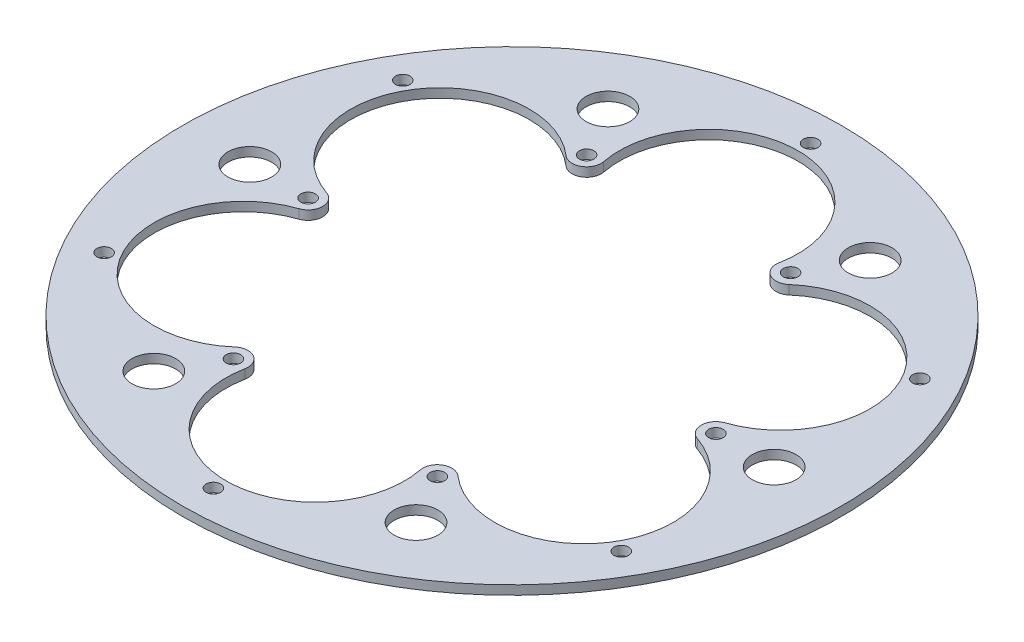
ISO-10303-21;
HEADER;
FILE_DESCRIPTION(('STEP AP214'),'2;1');
FILE_NAME('part.step','',(''),(''),'','','');
FILE_SCHEMA(('AUTOMOTIVE_DESIGN { 1 0 10303 214 1 1 1 1 }'));
ENDSEC;
DATA;
#1=APPLICATION_CONTEXT('core data for automotive mechanical design processes');
#2=APPLICATION_PROTOCOL_DEFINITION('international standard','automotive_design',2000,#1);
#3=PRODUCT_CONTEXT('',#1,'mechanical');
#4=PRODUCT('Part','Part','',(#3));
#5=PRODUCT_RELATED_PRODUCT_CATEGORY('part','',(#4));
#6=PRODUCT_DEFINITION_FORMATION('','',#4);
#7=PRODUCT_DEFINITION_CONTEXT('part definition',#1,'design');
#8=PRODUCT_DEFINITION('design','',#6,#7);
#9=PRODUCT_DEFINITION_SHAPE('','',#8);
#10=(LENGTH_UNIT() NAMED_UNIT(*) SI_UNIT(.MILLI.,.METRE.));
#11=(NAMED_UNIT(*) PLANE_ANGLE_UNIT() SI_UNIT($,.RADIAN.));
#12=(NAMED_UNIT(*) SI_UNIT($,.STERADIAN.) SOLID_ANGLE_UNIT());
#13=UNCERTAINTY_MEASURE_WITH_UNIT(LENGTH_MEASURE(1.E-05),#10,'distance_accuracy_value','');
#14=(GEOMETRIC_REPRESENTATION_CONTEXT(3) GLOBAL_UNCERTAINTY_ASSIGNED_CONTEXT((#13)) GLOBAL_UNIT_ASSIGNED_CONTEXT((#10,
#11,#12)) REPRESENTATION_CONTEXT('',''));
#15=CARTESIAN_POINT('',(0.,0.,0.));
#16=DIRECTION('',(0.,0.,1.));
#17=DIRECTION('',(1.,0.,0.));
#18=AXIS2_PLACEMENT_3D('',#15,#16,#17);
#19=CARTESIAN_POINT('',(0.,2.5,0.));
#20=DIRECTION('',(0.,1.,0.));
#21=DIRECTION('',(0.,0.,1.));
#22=AXIS2_PLACEMENT_3D('',#19,#20,#21);
#23=PLANE('',#22);
#24=CARTESIAN_POINT('',(-72.,2.5,0.));
#25=DIRECTION('',(0.,1.,0.));
#26=DIRECTION('',(0.,0.,1.));
#27=AXIS2_PLACEMENT_3D('',#24,#25,#26);
#28=CIRCLE('',#27,6.);
#29=CARTESIAN_POINT('',(-72.,2.5,6.00000000000006));
#30=VERTEX_POINT('',#29);
#31=EDGE_CURVE('E256',#30,#30,#28,.T.);
#32=ORIENTED_EDGE('',*,*,#31,.F.);
#33=EDGE_LOOP('',(#32));
#34=FACE_BOUND('',#33,.T.);
#35=CARTESIAN_POINT('',(-36.,2.5,62.3538290724796));
#36=DIRECTION('',(0.,1.,0.));
#37=DIRECTION('',(0.,0.,1.));
#38=AXIS2_PLACEMENT_3D('',#35,#36,#37);
#39=CIRCLE('',#38,6.);
#40=CARTESIAN_POINT('',(-36.,2.5,68.3538290724796));
#41=VERTEX_POINT('',#40);
#42=EDGE_CURVE('E260',#41,#41,#39,.T.);
#43=ORIENTED_EDGE('',*,*,#42,.F.);
#44=EDGE_LOOP('',(#43));
#45=FACE_BOUND('',#44,.T.);
#46=CARTESIAN_POINT('',(36.,2.5,-62.3538290724796));
#47=DIRECTION('',(0.,1.,0.));
#48=DIRECTION('',(0.,0.,1.));
#49=AXIS2_PLACEMENT_3D('',#46,#47,#48);
#50=CIRCLE('',#49,6.00000000000001);
#51=CARTESIAN_POINT('',(36.,2.5,-56.3538290724796));
#52=VERTEX_POINT('',#51);
#53=EDGE_CURVE('E264',#52,#52,#50,.T.);
#54=ORIENTED_EDGE('',*,*,#53,.F.);
#55=EDGE_LOOP('',(#54));
#56=FACE_BOUND('',#55,.T.);
#57=CARTESIAN_POINT('',(72.,2.5,0.));
#58=DIRECTION('',(0.,1.,0.));
#59=DIRECTION('',(0.,0.,1.));
#60=AXIS2_PLACEMENT_3D('',#57,#58,#59);
#61=CIRCLE('',#60,6.);
#62=CARTESIAN_POINT('',(72.,2.5,5.99999999999999));
#63=VERTEX_POINT('',#62);
#64=EDGE_CURVE('E268',#63,#63,#61,.T.);
#65=ORIENTED_EDGE('',*,*,#64,.F.);
#66=EDGE_LOOP('',(#65));
#67=FACE_BOUND('',#66,.T.);
#68=CARTESIAN_POINT('',(36.,2.5,62.3538290724796));
#69=DIRECTION('',(0.,1.,0.));
#70=DIRECTION('',(0.,0.,1.));
#71=AXIS2_PLACEMENT_3D('',#68,#69,#70);
#72=CIRCLE('',#71,6.);
#73=CARTESIAN_POINT('',(36.,2.5,68.3538290724796));
#74=VERTEX_POINT('',#73);
#75=EDGE_CURVE('E272',#74,#74,#72,.T.);
#76=ORIENTED_EDGE('',*,*,#75,.F.);
#77=EDGE_LOOP('',(#76));
#78=FACE_BOUND('',#77,.T.);
#79=CARTESIAN_POINT('',(-36.,2.5,-62.3538290724796));
#80=DIRECTION('',(0.,1.,0.));
#81=DIRECTION('',(0.,0.,1.));
#82=AXIS2_PLACEMENT_3D('',#79,#80,#81);
#83=CIRCLE('',#82,6.);
#84=CARTESIAN_POINT('',(-36.,2.5,-56.3538290724796));
#85=VERTEX_POINT('',#84);
#86=EDGE_CURVE('E276',#85,#85,#83,.T.);
#87=ORIENTED_EDGE('',*,*,#86,.F.);
#88=EDGE_LOOP('',(#87));
#89=FACE_BOUND('',#88,.T.);
#90=CARTESIAN_POINT('',(-56.,2.5,0.));
#91=DIRECTION('',(0.,1.,0.));
#92=DIRECTION('',(0.,0.,1.));
#93=AXIS2_PLACEMENT_3D('',#90,#91,#92);
#94=CIRCLE('',#93,2.00000000000001);
#95=CARTESIAN_POINT('',(-56.,2.5,2.00000000000002));
#96=VERTEX_POINT('',#95);
#97=EDGE_CURVE('E280',#96,#96,#94,.T.);
#98=ORIENTED_EDGE('',*,*,#97,.F.);
#99=EDGE_LOOP('',(#98));
#100=FACE_BOUND('',#99,.T.);
#101=CARTESIAN_POINT('',(-28.,2.5,48.4974226119286));
#102=DIRECTION('',(0.,1.,0.));
#103=DIRECTION('',(0.,0.,1.));
#104=AXIS2_PLACEMENT_3D('',#101,#102,#103);
#105=CIRCLE('',#104,2.00000000000001);
#106=CARTESIAN_POINT('',(-28.,2.5,50.4974226119286));
#107=VERTEX_POINT('',#106);
#108=EDGE_CURVE('E284',#107,#107,#105,.T.);
#109=ORIENTED_EDGE('',*,*,#108,.F.);
#110=EDGE_LOOP('',(#109));
#111=FACE_BOUND('',#110,.T.);
#112=CARTESIAN_POINT('',(28.,2.5,48.4974226119286));
#113=DIRECTION('',(0.,1.,0.));
#114=DIRECTION('',(0.,0.,1.));
#115=AXIS2_PLACEMENT_3D('',#112,#113,#114);
#116=CIRCLE('',#115,2.00000000000001);
#117=CARTESIAN_POINT('',(28.,2.5,50.4974226119286));
#118=VERTEX_POINT('',#117);
#119=EDGE_CURVE('E288',#118,#118,#116,.T.);
#120=ORIENTED_EDGE('',*,*,#119,.F.);
#121=EDGE_LOOP('',(#120));
#122=FACE_BOUND('',#121,.T.);
#123=CARTESIAN_POINT('',(56.,2.5,0.));
#124=DIRECTION('',(0.,1.,0.));
#125=DIRECTION('',(0.,0.,1.));
#126=AXIS2_PLACEMENT_3D('',#123,#124,#125);
#127=CIRCLE('',#126,2.00000000000001);
#128=CARTESIAN_POINT('',(56.,2.5,2.));
#129=VERTEX_POINT('',#128);
#130=EDGE_CURVE('E292',#129,#129,#127,.T.);
#131=ORIENTED_EDGE('',*,*,#130,.F.);
#132=EDGE_LOOP('',(#131));
#133=FACE_BOUND('',#132,.T.);
#134=CARTESIAN_POINT('',(28.,2.5,-48.4974226119285));
#135=DIRECTION('',(0.,1.,0.));
#136=DIRECTION('',(0.,0.,1.));
#137=AXIS2_PLACEMENT_3D('',#134,#135,#136);
#138=CIRCLE('',#137,2.00000000000001);
#139=CARTESIAN_POINT('',(28.,2.5,-46.4974226119285));
#140=VERTEX_POINT('',#139);
#141=EDGE_CURVE('E295',#140,#140,#138,.T.);
#142=ORIENTED_EDGE('',*,*,#141,.F.);
#143=EDGE_LOOP('',(#142));
#144=FACE_BOUND('',#143,.T.);
#145=CARTESIAN_POINT('',(-46.7653718043597,2.5,-27.));
#146=DIRECTION('',(0.,1.,0.));
#147=DIRECTION('',(0.,0.,1.));
#148=AXIS2_PLACEMENT_3D('',#145,#146,#147);
#149=CIRCLE('',#148,24.5355630382812);
#150=CARTESIAN_POINT('',(-30.6304540448962,2.5,-45.4840007168583));
#151=VERTEX_POINT('',#150);
#152=CARTESIAN_POINT('',(-54.705527108997,2.5,-3.7847509739028));
#153=VERTEX_POINT('',#152);
#154=EDGE_CURVE('E138',#151,#153,#149,.T.);
#155=ORIENTED_EDGE('',*,*,#154,.F.);
#156=CARTESIAN_POINT('',(-28.,2.5,-48.4974226119286));
#157=DIRECTION('',(0.,-1.,0.));
#158=DIRECTION('',(0.,0.,1.));
#159=AXIS2_PLACEMENT_3D('',#156,#157,#158);
#160=CIRCLE('',#159,3.99999999999998);
#161=CARTESIAN_POINT('',(-24.0750730641008,2.5,-49.2687516907611));
#162=VERTEX_POINT('',#161);
#163=EDGE_CURVE('E130',#162,#151,#160,.T.);
#164=ORIENTED_EDGE('',*,*,#163,.F.);
#165=CARTESIAN_POINT('',(0.,2.5,-54.));
#166=DIRECTION('',(0.,1.,0.));
#167=DIRECTION('',(0.,0.,1.));
#168=AXIS2_PLACEMENT_3D('',#165,#166,#167);
#169=CIRCLE('',#168,24.5355630382811);
#170=CARTESIAN_POINT('',(24.0750730641008,2.5,-49.2687516907611));
#171=VERTEX_POINT('',#170);
#172=EDGE_CURVE('E173',#171,#162,#169,.T.);
#173=ORIENTED_EDGE('',*,*,#172,.F.);
#174=CARTESIAN_POINT('',(28.,2.5,-48.4974226119285));
#175=DIRECTION('',(0.,-1.,0.));
#176=DIRECTION('',(0.,0.,1.));
#177=AXIS2_PLACEMENT_3D('',#174,#175,#176);
#178=CIRCLE('',#177,3.99999999999998);
#179=CARTESIAN_POINT('',(30.6304540448962,2.5,-45.4840007168583));
#180=VERTEX_POINT('',#179);
#181=EDGE_CURVE('E171',#180,#171,#178,.T.);
#182=ORIENTED_EDGE('',*,*,#181,.F.);
#183=CARTESIAN_POINT('',(46.7653718043597,2.5,-27.));
#184=DIRECTION('',(0.,1.,0.));
#185=DIRECTION('',(0.,0.,1.));
#186=AXIS2_PLACEMENT_3D('',#183,#184,#185);
#187=CIRCLE('',#186,24.5355630382811);
#188=CARTESIAN_POINT('',(54.705527108997,2.5,-3.78475097390282));
#189=VERTEX_POINT('',#188);
#190=EDGE_CURVE('E169',#189,#180,#187,.T.);
#191=ORIENTED_EDGE('',*,*,#190,.F.);
#192=CARTESIAN_POINT('',(56.,2.5,0.));
#193=DIRECTION('',(0.,-1.,0.));
#194=DIRECTION('',(0.,0.,1.));
#195=AXIS2_PLACEMENT_3D('',#192,#193,#194);
#196=CIRCLE('',#195,3.99999999999998);
#197=CARTESIAN_POINT('',(54.705527108997,2.5,3.7847509739028));
#198=VERTEX_POINT('',#197);
#199=EDGE_CURVE('E167',#198,#189,#196,.T.);
#200=ORIENTED_EDGE('',*,*,#199,.F.);
#201=CARTESIAN_POINT('',(46.7653718043597,2.5,27.));
#202=DIRECTION('',(0.,1.,0.));
#203=DIRECTION('',(0.,0.,1.));
#204=AXIS2_PLACEMENT_3D('',#201,#202,#203);
#205=CIRCLE('',#204,24.5355630382811);
#206=CARTESIAN_POINT('',(30.6304540448962,2.5,45.4840007168583));
#207=VERTEX_POINT('',#206);
#208=EDGE_CURVE('E165',#207,#198,#205,.T.);
#209=ORIENTED_EDGE('',*,*,#208,.F.);
#210=CARTESIAN_POINT('',(28.,2.5,48.4974226119286));
#211=DIRECTION('',(0.,-1.,0.));
#212=DIRECTION('',(0.,0.,1.));
#213=AXIS2_PLACEMENT_3D('',#210,#211,#212);
#214=CIRCLE('',#213,3.99999999999998);
#215=CARTESIAN_POINT('',(24.0750730641008,2.5,49.2687516907611));
#216=VERTEX_POINT('',#215);
#217=EDGE_CURVE('E163',#216,#207,#214,.T.);
#218=ORIENTED_EDGE('',*,*,#217,.F.);
#219=CARTESIAN_POINT('',(0.,2.5,54.));
#220=DIRECTION('',(0.,1.,0.));
#221=DIRECTION('',(0.,0.,1.));
#222=AXIS2_PLACEMENT_3D('',#219,#220,#221);
#223=CIRCLE('',#222,24.5355630382811);
#224=CARTESIAN_POINT('',(-24.0750730641008,2.5,49.2687516907611));
#225=VERTEX_POINT('',#224);
#226=EDGE_CURVE('E161',#225,#216,#223,.T.);
#227=ORIENTED_EDGE('',*,*,#226,.F.);
#228=CARTESIAN_POINT('',(-28.,2.5,48.4974226119286));
#229=DIRECTION('',(0.,-1.,0.));
#230=DIRECTION('',(0.,0.,1.));
#231=AXIS2_PLACEMENT_3D('',#228,#229,#230);
#232=CIRCLE('',#231,3.99999999999999);
#233=CARTESIAN_POINT('',(-30.6304540448962,2.5,45.4840007168583));
#234=VERTEX_POINT('',#233);
#235=EDGE_CURVE('E159',#234,#225,#232,.T.);
#236=ORIENTED_EDGE('',*,*,#235,.F.);
#237=CARTESIAN_POINT('',(-46.7653718043597,2.5,27.));
#238=DIRECTION('',(0.,1.,0.));
#239=DIRECTION('',(0.,0.,1.));
#240=AXIS2_PLACEMENT_3D('',#237,#238,#239);
#241=CIRCLE('',#240,24.5355630382811);
#242=CARTESIAN_POINT('',(-54.705527108997,2.5,3.78475097390285));
#243=VERTEX_POINT('',#242);
#244=EDGE_CURVE('E154',#243,#234,#241,.T.);
#245=ORIENTED_EDGE('',*,*,#244,.F.);
#246=CARTESIAN_POINT('',(-56.,2.5,0.));
#247=DIRECTION('',(0.,-1.,0.));
#248=DIRECTION('',(0.,0.,1.));
#249=AXIS2_PLACEMENT_3D('',#246,#247,#248);
#250=CIRCLE('',#249,3.99999999999997);
#251=EDGE_CURVE('E152',#153,#243,#250,.T.);
#252=ORIENTED_EDGE('',*,*,#251,.F.);
#253=EDGE_LOOP('',(#155,#164,#173,#182,#191,#200,#209,#218,#227,#236,#245,#252));
#254=FACE_BOUND('',#253,.T.);
#255=CARTESIAN_POINT('',(-28.,2.5,-48.4974226119286));
#256=DIRECTION('',(0.,1.,0.));
#257=DIRECTION('',(0.,0.,1.));
#258=AXIS2_PLACEMENT_3D('',#255,#256,#257);
#259=CIRCLE('',#258,2.00000000000001);
#260=CARTESIAN_POINT('',(-28.,2.5,-46.4974226119285));
#261=VERTEX_POINT('',#260);
#262=EDGE_CURVE('E226',#261,#261,#259,.T.);
#263=ORIENTED_EDGE('',*,*,#262,.F.);
#264=EDGE_LOOP('',(#263));
#265=FACE_BOUND('',#264,.T.);
#266=CARTESIAN_POINT('',(0.,2.5,0.));
#267=DIRECTION('',(0.,1.,0.));
#268=DIRECTION('',(0.,0.,1.));
#269=AXIS2_PLACEMENT_3D('',#266,#267,#268);
#270=CIRCLE('',#269,90.5);
#271=CARTESIAN_POINT('',(0.,2.5,90.5));
#272=VERTEX_POINT('',#271);
#273=EDGE_CURVE('E11',#272,#272,#270,.T.);
#274=ORIENTED_EDGE('',*,*,#273,.T.);
#275=EDGE_LOOP('',(#274));
#276=FACE_BOUND('',#275,.T.);
#277=CARTESIAN_POINT('',(0.,2.5,-82.));
#278=DIRECTION('',(0.,1.,0.));
#279=DIRECTION('',(0.,0.,1.));
#280=AXIS2_PLACEMENT_3D('',#277,#278,#279);
#281=CIRCLE('',#280,2.00000000000001);
#282=CARTESIAN_POINT('',(0.,2.5,-80.));
#283=VERTEX_POINT('',#282);
#284=EDGE_CURVE('E176',#283,#283,#281,.T.);
#285=ORIENTED_EDGE('',*,*,#284,.F.);
#286=EDGE_LOOP('',(#285));
#287=FACE_BOUND('',#286,.T.);
#288=CARTESIAN_POINT('',(71.014083110324,2.5,-41.));
#289=DIRECTION('',(0.,1.,0.));
#290=DIRECTION('',(0.,0.,1.));
#291=AXIS2_PLACEMENT_3D('',#288,#289,#290);
#292=CIRCLE('',#291,2.);
#293=CARTESIAN_POINT('',(71.014083110324,2.5,-39.));
#294=VERTEX_POINT('',#293);
#295=EDGE_CURVE('E302',#294,#294,#292,.T.);
#296=ORIENTED_EDGE('',*,*,#295,.F.);
#297=EDGE_LOOP('',(#296));
#298=FACE_BOUND('',#297,.T.);
#299=CARTESIAN_POINT('',(71.014083110324,2.5,41.));
#300=DIRECTION('',(0.,1.,0.));
#301=DIRECTION('',(0.,0.,1.));
#302=AXIS2_PLACEMENT_3D('',#299,#300,#301);
#303=CIRCLE('',#302,2.);
#304=CARTESIAN_POINT('',(71.014083110324,2.5,43.));
#305=VERTEX_POINT('',#304);
#306=EDGE_CURVE('E321',#305,#305,#303,.T.);
#307=ORIENTED_EDGE('',*,*,#306,.F.);
#308=EDGE_LOOP('',(#307));
#309=FACE_BOUND('',#308,.T.);
#310=CARTESIAN_POINT('',(0.,2.5,82.));
#311=DIRECTION('',(0.,1.,0.));
#312=DIRECTION('',(0.,0.,1.));
#313=AXIS2_PLACEMENT_3D('',#310,#311,#312);
#314=CIRCLE('',#313,2.00000000000001);
#315=CARTESIAN_POINT('',(0.,2.5,84.));
#316=VERTEX_POINT('',#315);
#317=EDGE_CURVE('E325',#316,#316,#314,.T.);
#318=ORIENTED_EDGE('',*,*,#317,.F.);
#319=EDGE_LOOP('',(#318));
#320=FACE_BOUND('',#319,.T.);
#321=CARTESIAN_POINT('',(-71.014083110324,2.5,41.));
#322=DIRECTION('',(0.,1.,0.));
#323=DIRECTION('',(0.,0.,1.));
#324=AXIS2_PLACEMENT_3D('',#321,#322,#323);
#325=CIRCLE('',#324,2.);
#326=CARTESIAN_POINT('',(-71.014083110324,2.5,43.));
#327=VERTEX_POINT('',#326);
#328=EDGE_CURVE('E329',#327,#327,#325,.T.);
#329=ORIENTED_EDGE('',*,*,#328,.F.);
#330=EDGE_LOOP('',(#329));
#331=FACE_BOUND('',#330,.T.);
#332=CARTESIAN_POINT('',(-71.014083110324,2.5,-40.9999999999999));
#333=DIRECTION('',(0.,1.,0.));
#334=DIRECTION('',(0.,0.,1.));
#335=AXIS2_PLACEMENT_3D('',#332,#333,#334);
#336=CIRCLE('',#335,2.);
#337=CARTESIAN_POINT('',(-71.014083110324,2.5,-38.9999999999999));
#338=VERTEX_POINT('',#337);
#339=EDGE_CURVE('E332',#338,#338,#336,.T.);
#340=ORIENTED_EDGE('',*,*,#339,.F.);
#341=EDGE_LOOP('',(#340));
#342=FACE_BOUND('',#341,.T.);
#343=ADVANCED_FACE('F41',(#34,#45,#56,#67,#78,#89,#100,#111,#122,#133,#144,#254,#265,#276,#287,
#298,#309,#320,#331,#342),#23,.T.);
#344=CARTESIAN_POINT('',(0.,0.,0.));
#345=DIRECTION('',(0.,1.,0.));
#346=DIRECTION('',(0.,0.,1.));
#347=AXIS2_PLACEMENT_3D('',#344,#345,#346);
#348=PLANE('',#347);
#349=CARTESIAN_POINT('',(-72.,0.,0.));
#350=DIRECTION('',(0.,1.,0.));
#351=DIRECTION('',(0.,0.,1.));
#352=AXIS2_PLACEMENT_3D('',#349,#350,#351);
#353=CIRCLE('',#352,6.);
#354=CARTESIAN_POINT('',(-72.,0.,6.00000000000006));
#355=VERTEX_POINT('',#354);
#356=EDGE_CURVE('E595',#355,#355,#353,.T.);
#357=ORIENTED_EDGE('',*,*,#356,.T.);
#358=EDGE_LOOP('',(#357));
#359=FACE_BOUND('',#358,.T.);
#360=CARTESIAN_POINT('',(-36.,0.,62.3538290724796));
#361=DIRECTION('',(0.,1.,0.));
#362=DIRECTION('',(0.,0.,1.));
#363=AXIS2_PLACEMENT_3D('',#360,#361,#362);
#364=CIRCLE('',#363,6.);
#365=CARTESIAN_POINT('',(-36.,0.,68.3538290724796));
#366=VERTEX_POINT('',#365);
#367=EDGE_CURVE('E602',#366,#366,#364,.T.);
#368=ORIENTED_EDGE('',*,*,#367,.T.);
#369=EDGE_LOOP('',(#368));
#370=FACE_BOUND('',#369,.T.);
#371=CARTESIAN_POINT('',(36.,0.,-62.3538290724796));
#372=DIRECTION('',(0.,1.,0.));
#373=DIRECTION('',(0.,0.,1.));
#374=AXIS2_PLACEMENT_3D('',#371,#372,#373);
#375=CIRCLE('',#374,6.00000000000001);
#376=CARTESIAN_POINT('',(36.,0.,-56.3538290724796));
#377=VERTEX_POINT('',#376);
#378=EDGE_CURVE('E608',#377,#377,#375,.T.);
#379=ORIENTED_EDGE('',*,*,#378,.T.);
#380=EDGE_LOOP('',(#379));
#381=FACE_BOUND('',#380,.T.);
#382=CARTESIAN_POINT('',(72.,0.,0.));
#383=DIRECTION('',(0.,1.,0.));
#384=DIRECTION('',(0.,0.,1.));
#385=AXIS2_PLACEMENT_3D('',#382,#383,#384);
#386=CIRCLE('',#385,6.);
#387=CARTESIAN_POINT('',(72.,0.,5.99999999999999));
#388=VERTEX_POINT('',#387);
#389=EDGE_CURVE('E614',#388,#388,#386,.T.);
#390=ORIENTED_EDGE('',*,*,#389,.T.);
#391=EDGE_LOOP('',(#390));
#392=FACE_BOUND('',#391,.T.);
#393=CARTESIAN_POINT('',(36.,0.,62.3538290724796));
#394=DIRECTION('',(0.,1.,0.));
#395=DIRECTION('',(0.,0.,1.));
#396=AXIS2_PLACEMENT_3D('',#393,#394,#395);
#397=CIRCLE('',#396,6.);
#398=CARTESIAN_POINT('',(36.,0.,68.3538290724796));
#399=VERTEX_POINT('',#398);
#400=EDGE_CURVE('E620',#399,#399,#397,.T.);
#401=ORIENTED_EDGE('',*,*,#400,.T.);
#402=EDGE_LOOP('',(#401));
#403=FACE_BOUND('',#402,.T.);
#404=CARTESIAN_POINT('',(-36.,0.,-62.3538290724796));
#405=DIRECTION('',(0.,1.,0.));
#406=DIRECTION('',(0.,0.,1.));
#407=AXIS2_PLACEMENT_3D('',#404,#405,#406);
#408=CIRCLE('',#407,6.);
#409=CARTESIAN_POINT('',(-36.,0.,-56.3538290724796));
#410=VERTEX_POINT('',#409);
#411=EDGE_CURVE('E340',#410,#410,#408,.T.);
#412=ORIENTED_EDGE('',*,*,#411,.T.);
#413=EDGE_LOOP('',(#412));
#414=FACE_BOUND('',#413,.T.);
#415=CARTESIAN_POINT('',(-28.,0.,-48.4974226119286));
#416=DIRECTION('',(0.,1.,0.));
#417=DIRECTION('',(0.,0.,1.));
#418=AXIS2_PLACEMENT_3D('',#415,#416,#417);
#419=CIRCLE('',#418,2.00000000000001);
#420=CARTESIAN_POINT('',(-28.,0.,-46.4974226119285));
#421=VERTEX_POINT('',#420);
#422=EDGE_CURVE('E146',#421,#421,#419,.T.);
#423=ORIENTED_EDGE('',*,*,#422,.T.);
#424=EDGE_LOOP('',(#423));
#425=FACE_BOUND('',#424,.T.);
#426=CARTESIAN_POINT('',(0.,0.,0.));
#427=DIRECTION('',(0.,1.,0.));
#428=DIRECTION('',(0.,0.,1.));
#429=AXIS2_PLACEMENT_3D('',#426,#427,#428);
#430=CIRCLE('',#429,90.5);
#431=CARTESIAN_POINT('',(0.,0.,90.5));
#432=VERTEX_POINT('',#431);
#433=EDGE_CURVE('E45',#432,#432,#430,.T.);
#434=ORIENTED_EDGE('',*,*,#433,.F.);
#435=EDGE_LOOP('',(#434));
#436=FACE_BOUND('',#435,.T.);
#437=CARTESIAN_POINT('',(-28.,0.,-48.4974226119286));
#438=DIRECTION('',(0.,-1.,0.));
#439=DIRECTION('',(0.,0.,1.));
#440=AXIS2_PLACEMENT_3D('',#437,#438,#439);
#441=CIRCLE('',#440,3.99999999999998);
#442=CARTESIAN_POINT('',(-24.0750730641008,0.,-49.2687516907611));
#443=VERTEX_POINT('',#442);
#444=CARTESIAN_POINT('',(-30.6304540448962,0.,-45.4840007168583));
#445=VERTEX_POINT('',#444);
#446=EDGE_CURVE('E64',#443,#445,#441,.T.);
#447=ORIENTED_EDGE('',*,*,#446,.T.);
#448=CARTESIAN_POINT('',(-46.7653718043597,0.,-27.));
#449=DIRECTION('',(0.,1.,0.));
#450=DIRECTION('',(0.,0.,1.));
#451=AXIS2_PLACEMENT_3D('',#448,#449,#450);
#452=CIRCLE('',#451,24.5355630382812);
#453=CARTESIAN_POINT('',(-54.705527108997,0.,-3.7847509739028));
#454=VERTEX_POINT('',#453);
#455=EDGE_CURVE('E145',#445,#454,#452,.T.);
#456=ORIENTED_EDGE('',*,*,#455,.T.);
#457=CARTESIAN_POINT('',(-56.,0.,0.));
#458=DIRECTION('',(0.,-1.,0.));
#459=DIRECTION('',(0.,0.,1.));
#460=AXIS2_PLACEMENT_3D('',#457,#458,#459);
#461=CIRCLE('',#460,3.99999999999997);
#462=CARTESIAN_POINT('',(-54.705527108997,0.,3.78475097390285));
#463=VERTEX_POINT('',#462);
#464=EDGE_CURVE('E178',#454,#463,#461,.T.);
#465=ORIENTED_EDGE('',*,*,#464,.T.);
#466=CARTESIAN_POINT('',(-46.7653718043597,0.,27.));
#467=DIRECTION('',(0.,1.,0.));
#468=DIRECTION('',(0.,0.,1.));
#469=AXIS2_PLACEMENT_3D('',#466,#467,#468);
#470=CIRCLE('',#469,24.5355630382811);
#471=CARTESIAN_POINT('',(-30.6304540448962,0.,45.4840007168583));
#472=VERTEX_POINT('',#471);
#473=EDGE_CURVE('E181',#463,#472,#470,.T.);
#474=ORIENTED_EDGE('',*,*,#473,.T.);
#475=CARTESIAN_POINT('',(-28.,0.,48.4974226119286));
#476=DIRECTION('',(0.,-1.,0.));
#477=DIRECTION('',(0.,0.,1.));
#478=AXIS2_PLACEMENT_3D('',#475,#476,#477);
#479=CIRCLE('',#478,3.99999999999999);
#480=CARTESIAN_POINT('',(-24.0750730641008,0.,49.2687516907611));
#481=VERTEX_POINT('',#480);
#482=EDGE_CURVE('E184',#472,#481,#479,.T.);
#483=ORIENTED_EDGE('',*,*,#482,.T.);
#484=CARTESIAN_POINT('',(0.,0.,54.));
#485=DIRECTION('',(0.,1.,0.));
#486=DIRECTION('',(0.,0.,1.));
#487=AXIS2_PLACEMENT_3D('',#484,#485,#486);
#488=CIRCLE('',#487,24.5355630382811);
#489=CARTESIAN_POINT('',(24.0750730641008,0.,49.2687516907611));
#490=VERTEX_POINT('',#489);
#491=EDGE_CURVE('E187',#481,#490,#488,.T.);
#492=ORIENTED_EDGE('',*,*,#491,.T.);
#493=CARTESIAN_POINT('',(28.,0.,48.4974226119286));
#494=DIRECTION('',(0.,-1.,0.));
#495=DIRECTION('',(0.,0.,1.));
#496=AXIS2_PLACEMENT_3D('',#493,#494,#495);
#497=CIRCLE('',#496,3.99999999999998);
#498=CARTESIAN_POINT('',(30.6304540448962,0.,45.4840007168583));
#499=VERTEX_POINT('',#498);
#500=EDGE_CURVE('E190',#490,#499,#497,.T.);
#501=ORIENTED_EDGE('',*,*,#500,.T.);
#502=CARTESIAN_POINT('',(46.7653718043597,0.,27.));
#503=DIRECTION('',(0.,1.,0.));
#504=DIRECTION('',(0.,0.,1.));
#505=AXIS2_PLACEMENT_3D('',#502,#503,#504);
#506=CIRCLE('',#505,24.5355630382811);
#507=CARTESIAN_POINT('',(54.705527108997,0.,3.7847509739028));
#508=VERTEX_POINT('',#507);
#509=EDGE_CURVE('E193',#499,#508,#506,.T.);
#510=ORIENTED_EDGE('',*,*,#509,.T.);
#511=CARTESIAN_POINT('',(56.,0.,0.));
#512=DIRECTION('',(0.,-1.,0.));
#513=DIRECTION('',(0.,0.,1.));
#514=AXIS2_PLACEMENT_3D('',#511,#512,#513);
#515=CIRCLE('',#514,3.99999999999998);
#516=CARTESIAN_POINT('',(54.705527108997,0.,-3.78475097390282));
#517=VERTEX_POINT('',#516);
#518=EDGE_CURVE('E196',#508,#517,#515,.T.);
#519=ORIENTED_EDGE('',*,*,#518,.T.);
#520=CARTESIAN_POINT('',(46.7653718043597,0.,-27.));
#521=DIRECTION('',(0.,1.,0.));
#522=DIRECTION('',(0.,0.,1.));
#523=AXIS2_PLACEMENT_3D('',#520,#521,#522);
#524=CIRCLE('',#523,24.5355630382811);
#525=CARTESIAN_POINT('',(30.6304540448962,0.,-45.4840007168583));
#526=VERTEX_POINT('',#525);
#527=EDGE_CURVE('E199',#517,#526,#524,.T.);
#528=ORIENTED_EDGE('',*,*,#527,.T.);
#529=CARTESIAN_POINT('',(28.,0.,-48.4974226119285));
#530=DIRECTION('',(0.,-1.,0.));
#531=DIRECTION('',(0.,0.,1.));
#532=AXIS2_PLACEMENT_3D('',#529,#530,#531);
#533=CIRCLE('',#532,3.99999999999998);
#534=CARTESIAN_POINT('',(24.0750730641008,0.,-49.2687516907611));
#535=VERTEX_POINT('',#534);
#536=EDGE_CURVE('E202',#526,#535,#533,.T.);
#537=ORIENTED_EDGE('',*,*,#536,.T.);
#538=CARTESIAN_POINT('',(0.,0.,-54.));
#539=DIRECTION('',(0.,1.,0.));
#540=DIRECTION('',(0.,0.,1.));
#541=AXIS2_PLACEMENT_3D('',#538,#539,#540);
#542=CIRCLE('',#541,24.5355630382811);
#543=EDGE_CURVE('E139',#535,#443,#542,.T.);
#544=ORIENTED_EDGE('',*,*,#543,.T.);
#545=EDGE_LOOP('',(#447,#456,#465,#474,#483,#492,#501,#510,#519,#528,#537,#544));
#546=FACE_BOUND('',#545,.T.);
#547=CARTESIAN_POINT('',(0.,0.,-82.));
#548=DIRECTION('',(0.,1.,0.));
#549=DIRECTION('',(0.,0.,1.));
#550=AXIS2_PLACEMENT_3D('',#547,#548,#549);
#551=CIRCLE('',#550,2.00000000000001);
#552=CARTESIAN_POINT('',(0.,0.,-80.));
#553=VERTEX_POINT('',#552);
#554=EDGE_CURVE('E297',#553,#553,#551,.T.);
#555=ORIENTED_EDGE('',*,*,#554,.T.);
#556=EDGE_LOOP('',(#555));
#557=FACE_BOUND('',#556,.T.);
#558=CARTESIAN_POINT('',(28.,0.,-48.4974226119285));
#559=DIRECTION('',(0.,1.,0.));
#560=DIRECTION('',(0.,0.,1.));
#561=AXIS2_PLACEMENT_3D('',#558,#559,#560);
#562=CIRCLE('',#561,2.00000000000001);
#563=CARTESIAN_POINT('',(28.,0.,-46.4974226119285));
#564=VERTEX_POINT('',#563);
#565=EDGE_CURVE('E298',#564,#564,#562,.T.);
#566=ORIENTED_EDGE('',*,*,#565,.T.);
#567=EDGE_LOOP('',(#566));
#568=FACE_BOUND('',#567,.T.);
#569=CARTESIAN_POINT('',(71.014083110324,0.,-41.));
#570=DIRECTION('',(0.,1.,0.));
#571=DIRECTION('',(0.,0.,1.));
#572=AXIS2_PLACEMENT_3D('',#569,#570,#571);
#573=CIRCLE('',#572,2.);
#574=CARTESIAN_POINT('',(71.014083110324,0.,-39.));
#575=VERTEX_POINT('',#574);
#576=EDGE_CURVE('E305',#575,#575,#573,.T.);
#577=ORIENTED_EDGE('',*,*,#576,.T.);
#578=EDGE_LOOP('',(#577));
#579=FACE_BOUND('',#578,.T.);
#580=CARTESIAN_POINT('',(56.,0.,0.));
#581=DIRECTION('',(0.,1.,0.));
#582=DIRECTION('',(0.,0.,1.));
#583=AXIS2_PLACEMENT_3D('',#580,#581,#582);
#584=CIRCLE('',#583,2.00000000000001);
#585=CARTESIAN_POINT('',(56.,0.,2.));
#586=VERTEX_POINT('',#585);
#587=EDGE_CURVE('E364',#586,#586,#584,.T.);
#588=ORIENTED_EDGE('',*,*,#587,.T.);
#589=EDGE_LOOP('',(#588));
#590=FACE_BOUND('',#589,.T.);
#591=CARTESIAN_POINT('',(71.014083110324,0.,41.));
#592=DIRECTION('',(0.,1.,0.));
#593=DIRECTION('',(0.,0.,1.));
#594=AXIS2_PLACEMENT_3D('',#591,#592,#593);
#595=CIRCLE('',#594,2.);
#596=CARTESIAN_POINT('',(71.014083110324,0.,43.));
#597=VERTEX_POINT('',#596);
#598=EDGE_CURVE('E360',#597,#597,#595,.T.);
#599=ORIENTED_EDGE('',*,*,#598,.T.);
#600=EDGE_LOOP('',(#599));
#601=FACE_BOUND('',#600,.T.);
#602=CARTESIAN_POINT('',(28.,0.,48.4974226119286));
#603=DIRECTION('',(0.,1.,0.));
#604=DIRECTION('',(0.,0.,1.));
#605=AXIS2_PLACEMENT_3D('',#602,#603,#604);
#606=CIRCLE('',#605,2.00000000000001);
#607=CARTESIAN_POINT('',(28.,0.,50.4974226119286));
#608=VERTEX_POINT('',#607);
#609=EDGE_CURVE('E356',#608,#608,#606,.T.);
#610=ORIENTED_EDGE('',*,*,#609,.T.);
#611=EDGE_LOOP('',(#610));
#612=FACE_BOUND('',#611,.T.);
#613=CARTESIAN_POINT('',(0.,0.,82.));
#614=DIRECTION('',(0.,1.,0.));
#615=DIRECTION('',(0.,0.,1.));
#616=AXIS2_PLACEMENT_3D('',#613,#614,#615);
#617=CIRCLE('',#616,2.00000000000001);
#618=CARTESIAN_POINT('',(0.,0.,84.));
#619=VERTEX_POINT('',#618);
#620=EDGE_CURVE('E352',#619,#619,#617,.T.);
#621=ORIENTED_EDGE('',*,*,#620,.T.);
#622=EDGE_LOOP('',(#621));
#623=FACE_BOUND('',#622,.T.);
#624=CARTESIAN_POINT('',(-28.,0.,48.4974226119286));
#625=DIRECTION('',(0.,1.,0.));
#626=DIRECTION('',(0.,0.,1.));
#627=AXIS2_PLACEMENT_3D('',#624,#625,#626);
#628=CIRCLE('',#627,2.00000000000001);
#629=CARTESIAN_POINT('',(-28.,0.,50.4974226119286));
#630=VERTEX_POINT('',#629);
#631=EDGE_CURVE('E348',#630,#630,#628,.T.);
#632=ORIENTED_EDGE('',*,*,#631,.T.);
#633=EDGE_LOOP('',(#632));
#634=FACE_BOUND('',#633,.T.);
#635=CARTESIAN_POINT('',(-71.014083110324,0.,41.));
#636=DIRECTION('',(0.,1.,0.));
#637=DIRECTION('',(0.,0.,1.));
#638=AXIS2_PLACEMENT_3D('',#635,#636,#637);
#639=CIRCLE('',#638,2.);
#640=CARTESIAN_POINT('',(-71.014083110324,0.,43.));
#641=VERTEX_POINT('',#640);
#642=EDGE_CURVE('E345',#641,#641,#639,.T.);
#643=ORIENTED_EDGE('',*,*,#642,.T.);
#644=EDGE_LOOP('',(#643));
#645=FACE_BOUND('',#644,.T.);
#646=CARTESIAN_POINT('',(-56.,0.,0.));
#647=DIRECTION('',(0.,1.,0.));
#648=DIRECTION('',(0.,0.,1.));
#649=AXIS2_PLACEMENT_3D('',#646,#647,#648);
#650=CIRCLE('',#649,2.00000000000001);
#651=CARTESIAN_POINT('',(-56.,0.,2.00000000000002));
#652=VERTEX_POINT('',#651);
#653=EDGE_CURVE('E334',#652,#652,#650,.T.);
#654=ORIENTED_EDGE('',*,*,#653,.T.);
#655=EDGE_LOOP('',(#654));
#656=FACE_BOUND('',#655,.T.);
#657=CARTESIAN_POINT('',(-71.014083110324,0.,-40.9999999999999));
#658=DIRECTION('',(0.,1.,0.));
#659=DIRECTION('',(0.,0.,1.));
#660=AXIS2_PLACEMENT_3D('',#657,#658,#659);
#661=CIRCLE('',#660,2.);
#662=CARTESIAN_POINT('',(-71.014083110324,0.,-38.9999999999999));
#663=VERTEX_POINT('',#662);
#664=EDGE_CURVE('E335',#663,#663,#661,.T.);
#665=ORIENTED_EDGE('',*,*,#664,.T.);
#666=EDGE_LOOP('',(#665));
#667=FACE_BOUND('',#666,.T.);
#668=ADVANCED_FACE('F232',(#359,#370,#381,#392,#403,#414,#425,#436,#546,#557,#568,#579,#590,
#601,#612,#623,#634,#645,#656,#667),#348,.F.);
#669=CARTESIAN_POINT('',(0.,2.5,0.));
#670=DIRECTION('',(0.,-1.,0.));
#671=DIRECTION('',(0.,0.,-1.));
#672=AXIS2_PLACEMENT_3D('',#669,#670,#671);
#673=CYLINDRICAL_SURFACE('',#672,90.5);
#674=ORIENTED_EDGE('',*,*,#273,.F.);
#675=EDGE_LOOP('',(#674));
#676=FACE_BOUND('',#675,.T.);
#677=ORIENTED_EDGE('',*,*,#433,.T.);
#678=EDGE_LOOP('',(#677));
#679=FACE_BOUND('',#678,.T.);
#680=ADVANCED_FACE('F43',(#676,#679),#673,.T.);
#681=CARTESIAN_POINT('',(-28.,2.5,-48.4974226119286));
#682=DIRECTION('',(0.,-1.,0.));
#683=DIRECTION('',(0.,0.,-1.));
#684=AXIS2_PLACEMENT_3D('',#681,#682,#683);
#685=CYLINDRICAL_SURFACE('',#684,2.00000000000001);
#686=ORIENTED_EDGE('',*,*,#262,.T.);
#687=EDGE_LOOP('',(#686));
#688=FACE_BOUND('',#687,.T.);
#689=ORIENTED_EDGE('',*,*,#422,.F.);
#690=EDGE_LOOP('',(#689));
#691=FACE_BOUND('',#690,.T.);
#692=ADVANCED_FACE('F235',(#688,#691),#685,.F.);
#693=CARTESIAN_POINT('',(-28.,2.5,-48.4974226119286));
#694=DIRECTION('',(0.,-1.,0.));
#695=DIRECTION('',(0.,0.,-1.));
#696=AXIS2_PLACEMENT_3D('',#693,#694,#695);
#697=CYLINDRICAL_SURFACE('',#696,3.99999999999998);
#698=ORIENTED_EDGE('',*,*,#446,.F.);
#699=DIRECTION('',(0.,-1.,0.));
#700=VECTOR('',#699,1.);
#701=CARTESIAN_POINT('',(-24.0750730641008,2.5,-49.2687516907611));
#702=LINE('',#701,#700);
#703=EDGE_CURVE('E134',#162,#443,#702,.T.);
#704=ORIENTED_EDGE('',*,*,#703,.F.);
#705=ORIENTED_EDGE('',*,*,#163,.T.);
#706=DIRECTION('',(0.,-1.,0.));
#707=VECTOR('',#706,1.);
#708=CARTESIAN_POINT('',(-30.6304540448962,2.5,-45.4840007168583));
#709=LINE('',#708,#707);
#710=EDGE_CURVE('E133',#151,#445,#709,.T.);
#711=ORIENTED_EDGE('',*,*,#710,.T.);
#712=EDGE_LOOP('',(#698,#704,#705,#711));
#713=FACE_BOUND('',#712,.T.);
#714=ADVANCED_FACE('F132',(#713),#697,.T.);
#715=CARTESIAN_POINT('',(-46.7653718043597,2.5,-27.));
#716=DIRECTION('',(0.,-1.,0.));
#717=DIRECTION('',(0.,0.,-1.));
#718=AXIS2_PLACEMENT_3D('',#715,#716,#717);
#719=CYLINDRICAL_SURFACE('',#718,24.5355630382812);
#720=ORIENTED_EDGE('',*,*,#455,.F.);
#721=ORIENTED_EDGE('',*,*,#710,.F.);
#722=ORIENTED_EDGE('',*,*,#154,.T.);
#723=DIRECTION('',(0.,-1.,0.));
#724=VECTOR('',#723,1.);
#725=CARTESIAN_POINT('',(-54.705527108997,2.5,-3.7847509739028));
#726=LINE('',#725,#724);
#727=EDGE_CURVE('E147',#153,#454,#726,.T.);
#728=ORIENTED_EDGE('',*,*,#727,.T.);
#729=EDGE_LOOP('',(#720,#721,#722,#728));
#730=FACE_BOUND('',#729,.T.);
#731=ADVANCED_FACE('F142',(#730),#719,.F.);
#732=CARTESIAN_POINT('',(-56.,2.5,0.));
#733=DIRECTION('',(0.,-1.,0.));
#734=DIRECTION('',(0.,0.,-1.));
#735=AXIS2_PLACEMENT_3D('',#732,#733,#734);
#736=CYLINDRICAL_SURFACE('',#735,3.99999999999997);
#737=ORIENTED_EDGE('',*,*,#464,.F.);
#738=ORIENTED_EDGE('',*,*,#727,.F.);
#739=ORIENTED_EDGE('',*,*,#251,.T.);
#740=DIRECTION('',(0.,-1.,0.));
#741=VECTOR('',#740,1.);
#742=CARTESIAN_POINT('',(-54.705527108997,2.5,3.78475097390285));
#743=LINE('',#742,#741);
#744=EDGE_CURVE('E223',#243,#463,#743,.T.);
#745=ORIENTED_EDGE('',*,*,#744,.T.);
#746=EDGE_LOOP('',(#737,#738,#739,#745));
#747=FACE_BOUND('',#746,.T.);
#748=ADVANCED_FACE('F426',(#747),#736,.T.);
#749=CARTESIAN_POINT('',(-46.7653718043597,2.5,27.));
#750=DIRECTION('',(0.,-1.,0.));
#751=DIRECTION('',(0.,0.,-1.));
#752=AXIS2_PLACEMENT_3D('',#749,#750,#751);
#753=CYLINDRICAL_SURFACE('',#752,24.5355630382811);
#754=ORIENTED_EDGE('',*,*,#473,.F.);
#755=ORIENTED_EDGE('',*,*,#744,.F.);
#756=ORIENTED_EDGE('',*,*,#244,.T.);
#757=DIRECTION('',(0.,-1.,0.));
#758=VECTOR('',#757,1.);
#759=CARTESIAN_POINT('',(-30.6304540448962,2.5,45.4840007168583));
#760=LINE('',#759,#758);
#761=EDGE_CURVE('E221',#234,#472,#760,.T.);
#762=ORIENTED_EDGE('',*,*,#761,.T.);
#763=EDGE_LOOP('',(#754,#755,#756,#762));
#764=FACE_BOUND('',#763,.T.);
#765=ADVANCED_FACE('F422',(#764),#753,.F.);
#766=CARTESIAN_POINT('',(-28.,2.5,48.4974226119286));
#767=DIRECTION('',(0.,-1.,0.));
#768=DIRECTION('',(0.,0.,-1.));
#769=AXIS2_PLACEMENT_3D('',#766,#767,#768);
#770=CYLINDRICAL_SURFACE('',#769,3.99999999999999);
#771=ORIENTED_EDGE('',*,*,#482,.F.);
#772=ORIENTED_EDGE('',*,*,#761,.F.);
#773=ORIENTED_EDGE('',*,*,#235,.T.);
#774=DIRECTION('',(0.,-1.,0.));
#775=VECTOR('',#774,1.);
#776=CARTESIAN_POINT('',(-24.0750730641008,2.5,49.2687516907611));
#777=LINE('',#776,#775);
#778=EDGE_CURVE('E219',#225,#481,#777,.T.);
#779=ORIENTED_EDGE('',*,*,#778,.T.);
#780=EDGE_LOOP('',(#771,#772,#773,#779));
#781=FACE_BOUND('',#780,.T.);
#782=ADVANCED_FACE('F418',(#781),#770,.T.);
#783=CARTESIAN_POINT('',(0.,2.5,54.));
#784=DIRECTION('',(0.,-1.,0.));
#785=DIRECTION('',(0.,0.,-1.));
#786=AXIS2_PLACEMENT_3D('',#783,#784,#785);
#787=CYLINDRICAL_SURFACE('',#786,24.5355630382811);
#788=ORIENTED_EDGE('',*,*,#491,.F.);
#789=ORIENTED_EDGE('',*,*,#778,.F.);
#790=ORIENTED_EDGE('',*,*,#226,.T.);
#791=DIRECTION('',(0.,-1.,0.));
#792=VECTOR('',#791,1.);
#793=CARTESIAN_POINT('',(24.0750730641008,2.5,49.2687516907611));
#794=LINE('',#793,#792);
#795=EDGE_CURVE('E217',#216,#490,#794,.T.);
#796=ORIENTED_EDGE('',*,*,#795,.T.);
#797=EDGE_LOOP('',(#788,#789,#790,#796));
#798=FACE_BOUND('',#797,.T.);
#799=ADVANCED_FACE('F414',(#798),#787,.F.);
#800=CARTESIAN_POINT('',(28.,2.5,48.4974226119286));
#801=DIRECTION('',(0.,-1.,0.));
#802=DIRECTION('',(0.,0.,-1.));
#803=AXIS2_PLACEMENT_3D('',#800,#801,#802);
#804=CYLINDRICAL_SURFACE('',#803,3.99999999999998);
#805=ORIENTED_EDGE('',*,*,#500,.F.);
#806=ORIENTED_EDGE('',*,*,#795,.F.);
#807=ORIENTED_EDGE('',*,*,#217,.T.);
#808=DIRECTION('',(0.,-1.,0.));
#809=VECTOR('',#808,1.);
#810=CARTESIAN_POINT('',(30.6304540448962,2.5,45.4840007168583));
#811=LINE('',#810,#809);
#812=EDGE_CURVE('E215',#207,#499,#811,.T.);
#813=ORIENTED_EDGE('',*,*,#812,.T.);
#814=EDGE_LOOP('',(#805,#806,#807,#813));
#815=FACE_BOUND('',#814,.T.);
#816=ADVANCED_FACE('F410',(#815),#804,.T.);
#817=CARTESIAN_POINT('',(46.7653718043597,2.5,27.));
#818=DIRECTION('',(0.,-1.,0.));
#819=DIRECTION('',(0.,0.,-1.));
#820=AXIS2_PLACEMENT_3D('',#817,#818,#819);
#821=CYLINDRICAL_SURFACE('',#820,24.5355630382811);
#822=ORIENTED_EDGE('',*,*,#509,.F.);
#823=ORIENTED_EDGE('',*,*,#812,.F.);
#824=ORIENTED_EDGE('',*,*,#208,.T.);
#825=DIRECTION('',(0.,-1.,0.));
#826=VECTOR('',#825,1.);
#827=CARTESIAN_POINT('',(54.705527108997,2.5,3.7847509739028));
#828=LINE('',#827,#826);
#829=EDGE_CURVE('E213',#198,#508,#828,.T.);
#830=ORIENTED_EDGE('',*,*,#829,.T.);
#831=EDGE_LOOP('',(#822,#823,#824,#830));
#832=FACE_BOUND('',#831,.T.);
#833=ADVANCED_FACE('F406',(#832),#821,.F.);
#834=CARTESIAN_POINT('',(56.,2.5,0.));
#835=DIRECTION('',(0.,-1.,0.));
#836=DIRECTION('',(0.,0.,-1.));
#837=AXIS2_PLACEMENT_3D('',#834,#835,#836);
#838=CYLINDRICAL_SURFACE('',#837,3.99999999999998);
#839=ORIENTED_EDGE('',*,*,#518,.F.);
#840=ORIENTED_EDGE('',*,*,#829,.F.);
#841=ORIENTED_EDGE('',*,*,#199,.T.);
#842=DIRECTION('',(0.,-1.,0.));
#843=VECTOR('',#842,1.);
#844=CARTESIAN_POINT('',(54.705527108997,2.5,-3.78475097390282));
#845=LINE('',#844,#843);
#846=EDGE_CURVE('E211',#189,#517,#845,.T.);
#847=ORIENTED_EDGE('',*,*,#846,.T.);
#848=EDGE_LOOP('',(#839,#840,#841,#847));
#849=FACE_BOUND('',#848,.T.);
#850=ADVANCED_FACE('F402',(#849),#838,.T.);
#851=CARTESIAN_POINT('',(46.7653718043597,2.5,-27.));
#852=DIRECTION('',(0.,-1.,0.));
#853=DIRECTION('',(0.,0.,-1.));
#854=AXIS2_PLACEMENT_3D('',#851,#852,#853);
#855=CYLINDRICAL_SURFACE('',#854,24.5355630382811);
#856=ORIENTED_EDGE('',*,*,#527,.F.);
#857=ORIENTED_EDGE('',*,*,#846,.F.);
#858=ORIENTED_EDGE('',*,*,#190,.T.);
#859=DIRECTION('',(0.,-1.,0.));
#860=VECTOR('',#859,1.);
#861=CARTESIAN_POINT('',(30.6304540448962,2.5,-45.4840007168583));
#862=LINE('',#861,#860);
#863=EDGE_CURVE('E209',#180,#526,#862,.T.);
#864=ORIENTED_EDGE('',*,*,#863,.T.);
#865=EDGE_LOOP('',(#856,#857,#858,#864));
#866=FACE_BOUND('',#865,.T.);
#867=ADVANCED_FACE('F398',(#866),#855,.F.);
#868=CARTESIAN_POINT('',(28.,2.5,-48.4974226119285));
#869=DIRECTION('',(0.,-1.,0.));
#870=DIRECTION('',(0.,0.,-1.));
#871=AXIS2_PLACEMENT_3D('',#868,#869,#870);
#872=CYLINDRICAL_SURFACE('',#871,3.99999999999998);
#873=ORIENTED_EDGE('',*,*,#536,.F.);
#874=ORIENTED_EDGE('',*,*,#863,.F.);
#875=ORIENTED_EDGE('',*,*,#181,.T.);
#876=DIRECTION('',(0.,-1.,0.));
#877=VECTOR('',#876,1.);
#878=CARTESIAN_POINT('',(24.0750730641008,2.5,-49.2687516907611));
#879=LINE('',#878,#877);
#880=EDGE_CURVE('E56',#171,#535,#879,.T.);
#881=ORIENTED_EDGE('',*,*,#880,.T.);
#882=EDGE_LOOP('',(#873,#874,#875,#881));
#883=FACE_BOUND('',#882,.T.);
#884=ADVANCED_FACE('F395',(#883),#872,.T.);
#885=CARTESIAN_POINT('',(0.,2.5,-54.));
#886=DIRECTION('',(0.,-1.,0.));
#887=DIRECTION('',(0.,0.,-1.));
#888=AXIS2_PLACEMENT_3D('',#885,#886,#887);
#889=CYLINDRICAL_SURFACE('',#888,24.5355630382811);
#890=ORIENTED_EDGE('',*,*,#543,.F.);
#891=ORIENTED_EDGE('',*,*,#880,.F.);
#892=ORIENTED_EDGE('',*,*,#172,.T.);
#893=ORIENTED_EDGE('',*,*,#703,.T.);
#894=EDGE_LOOP('',(#890,#891,#892,#893));
#895=FACE_BOUND('',#894,.T.);
#896=ADVANCED_FACE('F392',(#895),#889,.F.);
#897=CARTESIAN_POINT('',(0.,2.5,-82.));
#898=DIRECTION('',(0.,-1.,0.));
#899=DIRECTION('',(0.,0.,-1.));
#900=AXIS2_PLACEMENT_3D('',#897,#898,#899);
#901=CYLINDRICAL_SURFACE('',#900,2.00000000000001);
#902=ORIENTED_EDGE('',*,*,#284,.T.);
#903=EDGE_LOOP('',(#902));
#904=FACE_BOUND('',#903,.T.);
#905=ORIENTED_EDGE('',*,*,#554,.F.);
#906=EDGE_LOOP('',(#905));
#907=FACE_BOUND('',#906,.T.);
#908=ADVANCED_FACE('F311',(#904,#907),#901,.F.);
#909=CARTESIAN_POINT('',(28.,2.5,-48.4974226119285));
#910=DIRECTION('',(0.,-1.,0.));
#911=DIRECTION('',(0.,0.,-1.));
#912=AXIS2_PLACEMENT_3D('',#909,#910,#911);
#913=CYLINDRICAL_SURFACE('',#912,2.00000000000001);
#914=ORIENTED_EDGE('',*,*,#141,.T.);
#915=EDGE_LOOP('',(#914));
#916=FACE_BOUND('',#915,.T.);
#917=ORIENTED_EDGE('',*,*,#565,.F.);
#918=EDGE_LOOP('',(#917));
#919=FACE_BOUND('',#918,.T.);
#920=ADVANCED_FACE('F378',(#916,#919),#913,.F.);
#921=CARTESIAN_POINT('',(71.014083110324,2.5,-41.));
#922=DIRECTION('',(0.,-1.,0.));
#923=DIRECTION('',(0.,0.,-1.));
#924=AXIS2_PLACEMENT_3D('',#921,#922,#923);
#925=CYLINDRICAL_SURFACE('',#924,2.);
#926=ORIENTED_EDGE('',*,*,#295,.T.);
#927=EDGE_LOOP('',(#926));
#928=FACE_BOUND('',#927,.T.);
#929=ORIENTED_EDGE('',*,*,#576,.F.);
#930=EDGE_LOOP('',(#929));
#931=FACE_BOUND('',#930,.T.);
#932=ADVANCED_FACE('F375',(#928,#931),#925,.F.);
#933=CARTESIAN_POINT('',(56.,2.5,0.));
#934=DIRECTION('',(0.,-1.,0.));
#935=DIRECTION('',(0.,0.,-1.));
#936=AXIS2_PLACEMENT_3D('',#933,#934,#935);
#937=CYLINDRICAL_SURFACE('',#936,2.00000000000001);
#938=ORIENTED_EDGE('',*,*,#130,.T.);
#939=EDGE_LOOP('',(#938));
#940=FACE_BOUND('',#939,.T.);
#941=ORIENTED_EDGE('',*,*,#587,.F.);
#942=EDGE_LOOP('',(#941));
#943=FACE_BOUND('',#942,.T.);
#944=ADVANCED_FACE('F377',(#940,#943),#937,.F.);
#945=CARTESIAN_POINT('',(71.014083110324,2.5,41.));
#946=DIRECTION('',(0.,-1.,0.));
#947=DIRECTION('',(0.,0.,-1.));
#948=AXIS2_PLACEMENT_3D('',#945,#946,#947);
#949=CYLINDRICAL_SURFACE('',#948,2.);
#950=ORIENTED_EDGE('',*,*,#306,.T.);
#951=EDGE_LOOP('',(#950));
#952=FACE_BOUND('',#951,.T.);
#953=ORIENTED_EDGE('',*,*,#598,.F.);
#954=EDGE_LOOP('',(#953));
#955=FACE_BOUND('',#954,.T.);
#956=ADVANCED_FACE('F384',(#952,#955),#949,.F.);
#957=CARTESIAN_POINT('',(28.,2.5,48.4974226119286));
#958=DIRECTION('',(0.,-1.,0.));
#959=DIRECTION('',(0.,0.,-1.));
#960=AXIS2_PLACEMENT_3D('',#957,#958,#959);
#961=CYLINDRICAL_SURFACE('',#960,2.00000000000001);
#962=ORIENTED_EDGE('',*,*,#119,.T.);
#963=EDGE_LOOP('',(#962));
#964=FACE_BOUND('',#963,.T.);
#965=ORIENTED_EDGE('',*,*,#609,.F.);
#966=EDGE_LOOP('',(#965));
#967=FACE_BOUND('',#966,.T.);
#968=ADVANCED_FACE('F497',(#964,#967),#961,.F.);
#969=CARTESIAN_POINT('',(0.,2.5,82.));
#970=DIRECTION('',(0.,-1.,0.));
#971=DIRECTION('',(0.,0.,-1.));
#972=AXIS2_PLACEMENT_3D('',#969,#970,#971);
#973=CYLINDRICAL_SURFACE('',#972,2.00000000000001);
#974=ORIENTED_EDGE('',*,*,#317,.T.);
#975=EDGE_LOOP('',(#974));
#976=FACE_BOUND('',#975,.T.);
#977=ORIENTED_EDGE('',*,*,#620,.F.);
#978=EDGE_LOOP('',(#977));
#979=FACE_BOUND('',#978,.T.);
#980=ADVANCED_FACE('F504',(#976,#979),#973,.F.);
#981=CARTESIAN_POINT('',(-28.,2.5,48.4974226119286));
#982=DIRECTION('',(0.,-1.,0.));
#983=DIRECTION('',(0.,0.,-1.));
#984=AXIS2_PLACEMENT_3D('',#981,#982,#983);
#985=CYLINDRICAL_SURFACE('',#984,2.00000000000001);
#986=ORIENTED_EDGE('',*,*,#108,.T.);
#987=EDGE_LOOP('',(#986));
#988=FACE_BOUND('',#987,.T.);
#989=ORIENTED_EDGE('',*,*,#631,.F.);
#990=EDGE_LOOP('',(#989));
#991=FACE_BOUND('',#990,.T.);
#992=ADVANCED_FACE('F512',(#988,#991),#985,.F.);
#993=CARTESIAN_POINT('',(-71.014083110324,2.5,41.));
#994=DIRECTION('',(0.,-1.,0.));
#995=DIRECTION('',(0.,0.,-1.));
#996=AXIS2_PLACEMENT_3D('',#993,#994,#995);
#997=CYLINDRICAL_SURFACE('',#996,2.);
#998=ORIENTED_EDGE('',*,*,#328,.T.);
#999=EDGE_LOOP('',(#998));
#1000=FACE_BOUND('',#999,.T.);
#1001=ORIENTED_EDGE('',*,*,#642,.F.);
#1002=EDGE_LOOP('',(#1001));
#1003=FACE_BOUND('',#1002,.T.);
#1004=ADVANCED_FACE('F520',(#1000,#1003),#997,.F.);
#1005=CARTESIAN_POINT('',(-56.,2.5,0.));
#1006=DIRECTION('',(0.,-1.,0.));
#1007=DIRECTION('',(0.,0.,-1.));
#1008=AXIS2_PLACEMENT_3D('',#1005,#1006,#1007);
#1009=CYLINDRICAL_SURFACE('',#1008,2.00000000000001);
#1010=ORIENTED_EDGE('',*,*,#97,.T.);
#1011=EDGE_LOOP('',(#1010));
#1012=FACE_BOUND('',#1011,.T.);
#1013=ORIENTED_EDGE('',*,*,#653,.F.);
#1014=EDGE_LOOP('',(#1013));
#1015=FACE_BOUND('',#1014,.T.);
#1016=ADVANCED_FACE('F528',(#1012,#1015),#1009,.F.);
#1017=CARTESIAN_POINT('',(-71.014083110324,2.5,-40.9999999999999));
#1018=DIRECTION('',(0.,-1.,0.));
#1019=DIRECTION('',(0.,0.,-1.));
#1020=AXIS2_PLACEMENT_3D('',#1017,#1018,#1019);
#1021=CYLINDRICAL_SURFACE('',#1020,2.);
#1022=ORIENTED_EDGE('',*,*,#339,.T.);
#1023=EDGE_LOOP('',(#1022));
#1024=FACE_BOUND('',#1023,.T.);
#1025=ORIENTED_EDGE('',*,*,#664,.F.);
#1026=EDGE_LOOP('',(#1025));
#1027=FACE_BOUND('',#1026,.T.);
#1028=ADVANCED_FACE('F536',(#1024,#1027),#1021,.F.);
#1029=CARTESIAN_POINT('',(-36.,0.,-62.3538290724796));
#1030=DIRECTION('',(0.,1.,0.));
#1031=DIRECTION('',(0.,0.,1.));
#1032=AXIS2_PLACEMENT_3D('',#1029,#1030,#1031);
#1033=CYLINDRICAL_SURFACE('',#1032,6.);
#1034=ORIENTED_EDGE('',*,*,#411,.F.);
#1035=EDGE_LOOP('',(#1034));
#1036=FACE_BOUND('',#1035,.T.);
#1037=ORIENTED_EDGE('',*,*,#86,.T.);
#1038=EDGE_LOOP('',(#1037));
#1039=FACE_BOUND('',#1038,.T.);
#1040=ADVANCED_FACE('F543',(#1036,#1039),#1033,.F.);
#1041=CARTESIAN_POINT('',(36.,0.,62.3538290724796));
#1042=DIRECTION('',(0.,1.,0.));
#1043=DIRECTION('',(0.,0.,1.));
#1044=AXIS2_PLACEMENT_3D('',#1041,#1042,#1043);
#1045=CYLINDRICAL_SURFACE('',#1044,6.);
#1046=ORIENTED_EDGE('',*,*,#400,.F.);
#1047=EDGE_LOOP('',(#1046));
#1048=FACE_BOUND('',#1047,.T.);
#1049=ORIENTED_EDGE('',*,*,#75,.T.);
#1050=EDGE_LOOP('',(#1049));
#1051=FACE_BOUND('',#1050,.T.);
#1052=ADVANCED_FACE('F550',(#1048,#1051),#1045,.F.);
#1053=CARTESIAN_POINT('',(72.,0.,0.));
#1054=DIRECTION('',(0.,1.,0.));
#1055=DIRECTION('',(0.,0.,1.));
#1056=AXIS2_PLACEMENT_3D('',#1053,#1054,#1055);
#1057=CYLINDRICAL_SURFACE('',#1056,6.);
#1058=ORIENTED_EDGE('',*,*,#389,.F.);
#1059=EDGE_LOOP('',(#1058));
#1060=FACE_BOUND('',#1059,.T.);
#1061=ORIENTED_EDGE('',*,*,#64,.T.);
#1062=EDGE_LOOP('',(#1061));
#1063=FACE_BOUND('',#1062,.T.);
#1064=ADVANCED_FACE('F558',(#1060,#1063),#1057,.F.);
#1065=CARTESIAN_POINT('',(36.,0.,-62.3538290724796));
#1066=DIRECTION('',(0.,1.,0.));
#1067=DIRECTION('',(0.,0.,1.));
#1068=AXIS2_PLACEMENT_3D('',#1065,#1066,#1067);
#1069=CYLINDRICAL_SURFACE('',#1068,6.00000000000001);
#1070=ORIENTED_EDGE('',*,*,#378,.F.);
#1071=EDGE_LOOP('',(#1070));
#1072=FACE_BOUND('',#1071,.T.);
#1073=ORIENTED_EDGE('',*,*,#53,.T.);
#1074=EDGE_LOOP('',(#1073));
#1075=FACE_BOUND('',#1074,.T.);
#1076=ADVANCED_FACE('F566',(#1072,#1075),#1069,.F.);
#1077=CARTESIAN_POINT('',(-36.,0.,62.3538290724796));
#1078=DIRECTION('',(0.,1.,0.));
#1079=DIRECTION('',(0.,0.,1.));
#1080=AXIS2_PLACEMENT_3D('',#1077,#1078,#1079);
#1081=CYLINDRICAL_SURFACE('',#1080,6.);
#1082=ORIENTED_EDGE('',*,*,#367,.F.);
#1083=EDGE_LOOP('',(#1082));
#1084=FACE_BOUND('',#1083,.T.);
#1085=ORIENTED_EDGE('',*,*,#42,.T.);
#1086=EDGE_LOOP('',(#1085));
#1087=FACE_BOUND('',#1086,.T.);
#1088=ADVANCED_FACE('F574',(#1084,#1087),#1081,.F.);
#1089=CARTESIAN_POINT('',(-72.,0.,0.));
#1090=DIRECTION('',(0.,1.,0.));
#1091=DIRECTION('',(0.,0.,1.));
#1092=AXIS2_PLACEMENT_3D('',#1089,#1090,#1091);
#1093=CYLINDRICAL_SURFACE('',#1092,6.);
#1094=ORIENTED_EDGE('',*,*,#356,.F.);
#1095=EDGE_LOOP('',(#1094));
#1096=FACE_BOUND('',#1095,.T.);
#1097=ORIENTED_EDGE('',*,*,#31,.T.);
#1098=EDGE_LOOP('',(#1097));
#1099=FACE_BOUND('',#1098,.T.);
#1100=ADVANCED_FACE('F582',(#1096,#1099),#1093,.F.);
#1101=CLOSED_SHELL('',(#343,#668,#680,#692,#714,#731,#748,#765,#782,#799,#816,#833,#850,#867,
#884,#896,#908,#920,#932,#944,#956,#968,#980,#992,#1004,#1016,#1028,#1040,#1052,#1064,#1076,
#1088,#1100));
#1102=MANIFOLD_SOLID_BREP('B2',#1101);
#1103=ADVANCED_BREP_SHAPE_REPRESENTATION('',(#18,#1102),#14);
#1104=SHAPE_DEFINITION_REPRESENTATION(#9,#1103);
ENDSEC;
END-ISO-10303-21;
